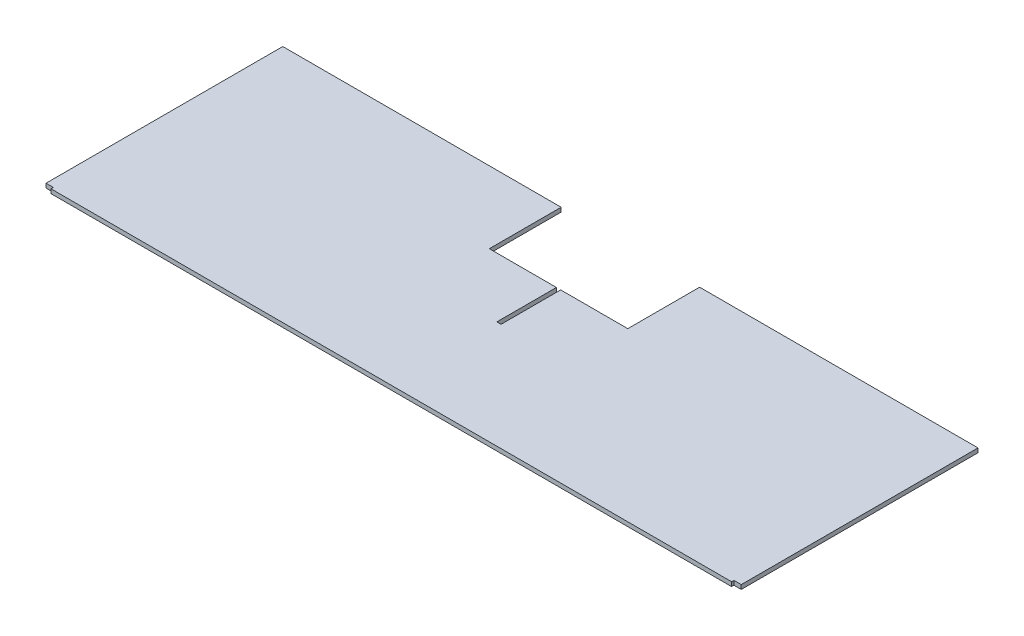
ISO-10303-21;
HEADER;
FILE_DESCRIPTION(('STEP AP214'),'2;1');
FILE_NAME('part.step','',(''),(''),'','','');
FILE_SCHEMA(('AUTOMOTIVE_DESIGN { 1 0 10303 214 1 1 1 1 }'));
ENDSEC;
DATA;
#1=APPLICATION_CONTEXT('core data for automotive mechanical design processes');
#2=APPLICATION_PROTOCOL_DEFINITION('international standard','automotive_design',2000,#1);
#3=PRODUCT_CONTEXT('',#1,'mechanical');
#4=PRODUCT('Part','Part','',(#3));
#5=PRODUCT_RELATED_PRODUCT_CATEGORY('part','',(#4));
#6=PRODUCT_DEFINITION_FORMATION('','',#4);
#7=PRODUCT_DEFINITION_CONTEXT('part definition',#1,'design');
#8=PRODUCT_DEFINITION('design','',#6,#7);
#9=PRODUCT_DEFINITION_SHAPE('','',#8);
#10=(LENGTH_UNIT() NAMED_UNIT(*) SI_UNIT(.MILLI.,.METRE.));
#11=(NAMED_UNIT(*) PLANE_ANGLE_UNIT() SI_UNIT($,.RADIAN.));
#12=(NAMED_UNIT(*) SI_UNIT($,.STERADIAN.) SOLID_ANGLE_UNIT());
#13=UNCERTAINTY_MEASURE_WITH_UNIT(LENGTH_MEASURE(1.E-05),#10,'distance_accuracy_value','');
#14=(GEOMETRIC_REPRESENTATION_CONTEXT(3) GLOBAL_UNCERTAINTY_ASSIGNED_CONTEXT((#13)) GLOBAL_UNIT_ASSIGNED_CONTEXT((#10,
#11,#12)) REPRESENTATION_CONTEXT('',''));
#15=CARTESIAN_POINT('',(0.,0.,0.));
#16=DIRECTION('',(0.,0.,1.));
#17=DIRECTION('',(1.,0.,0.));
#18=AXIS2_PLACEMENT_3D('',#15,#16,#17);
#19=CARTESIAN_POINT('',(-260.999093317,3.2,-99.5000000089999));
#20=DIRECTION('',(0.,0.,1.));
#21=DIRECTION('',(-1.,0.,0.));
#22=AXIS2_PLACEMENT_3D('',#19,#20,#21);
#23=PLANE('',#22);
#24=DIRECTION('',(0.,1.,0.));
#25=VECTOR('',#24,1.);
#26=CARTESIAN_POINT('',(54.4806399840001,0.,-99.500000009));
#27=LINE('',#26,#25);
#28=CARTESIAN_POINT('',(54.4806399840001,0.,-99.500000009));
#29=VERTEX_POINT('',#28);
#30=CARTESIAN_POINT('',(54.4806399840001,3.2,-99.500000009));
#31=VERTEX_POINT('',#30);
#32=EDGE_CURVE('E297',#29,#31,#27,.T.);
#33=ORIENTED_EDGE('',*,*,#32,.T.);
#34=DIRECTION('',(-1.,0.,0.));
#35=VECTOR('',#34,1.);
#36=CARTESIAN_POINT('',(-260.999093317,3.2,-99.5000000089999));
#37=LINE('',#36,#35);
#38=CARTESIAN_POINT('',(265.160373285,3.2,-99.500000009));
#39=VERTEX_POINT('',#38);
#40=EDGE_CURVE('E241',#39,#31,#37,.T.);
#41=ORIENTED_EDGE('',*,*,#40,.F.);
#42=DIRECTION('',(0.,1.,0.));
#43=VECTOR('',#42,1.);
#44=CARTESIAN_POINT('',(265.160373285,3.2,-99.500000009));
#45=LINE('',#44,#43);
#46=CARTESIAN_POINT('',(265.160373285,0.,-99.500000009));
#47=VERTEX_POINT('',#46);
#48=EDGE_CURVE('E194',#47,#39,#45,.T.);
#49=ORIENTED_EDGE('',*,*,#48,.F.);
#50=DIRECTION('',(1.,0.,0.));
#51=VECTOR('',#50,1.);
#52=CARTESIAN_POINT('',(0.,0.,-99.500000009));
#53=LINE('',#52,#51);
#54=EDGE_CURVE('E181',#47,#29,#53,.F.);
#55=ORIENTED_EDGE('',*,*,#54,.T.);
#56=EDGE_LOOP('',(#33,#41,#49,#55));
#57=FACE_BOUND('',#56,.T.);
#58=ADVANCED_FACE('F44',(#57),#23,.F.);
#59=CARTESIAN_POINT('',(-260.999093317,3.2,79.6876266290001));
#60=DIRECTION('',(1.,0.,0.));
#61=DIRECTION('',(0.,0.,1.));
#62=AXIS2_PLACEMENT_3D('',#59,#60,#61);
#63=PLANE('',#62);
#64=DIRECTION('',(0.,1.,0.));
#65=VECTOR('',#64,1.);
#66=CARTESIAN_POINT('',(-260.999093317,3.2,-99.5000000089999));
#67=LINE('',#66,#65);
#68=CARTESIAN_POINT('',(-260.999093317,0.,-99.5000000089999));
#69=VERTEX_POINT('',#68);
#70=CARTESIAN_POINT('',(-260.999093317,3.2,-99.5000000089999));
#71=VERTEX_POINT('',#70);
#72=EDGE_CURVE('E52',#69,#71,#67,.T.);
#73=ORIENTED_EDGE('',*,*,#72,.F.);
#74=DIRECTION('',(0.,0.,-1.));
#75=VECTOR('',#74,1.);
#76=CARTESIAN_POINT('',(-260.999093317,0.,0.));
#77=LINE('',#76,#75);
#78=CARTESIAN_POINT('',(-260.999093317,0.,79.6876266290001));
#79=VERTEX_POINT('',#78);
#80=EDGE_CURVE('E180',#69,#79,#77,.F.);
#81=ORIENTED_EDGE('',*,*,#80,.T.);
#82=DIRECTION('',(0.,1.,0.));
#83=VECTOR('',#82,1.);
#84=CARTESIAN_POINT('',(-260.999093317,3.2,79.6876266290001));
#85=LINE('',#84,#83);
#86=CARTESIAN_POINT('',(-260.999093317,3.2,79.6876266290001));
#87=VERTEX_POINT('',#86);
#88=EDGE_CURVE('E202',#79,#87,#85,.T.);
#89=ORIENTED_EDGE('',*,*,#88,.T.);
#90=DIRECTION('',(0.,0.,1.));
#91=VECTOR('',#90,1.);
#92=CARTESIAN_POINT('',(-260.999093317,3.2,79.6876266290001));
#93=LINE('',#92,#91);
#94=EDGE_CURVE('E237',#71,#87,#93,.T.);
#95=ORIENTED_EDGE('',*,*,#94,.F.);
#96=EDGE_LOOP('',(#73,#81,#89,#95));
#97=FACE_BOUND('',#96,.T.);
#98=ADVANCED_FACE('F234',(#97),#63,.F.);
#99=CARTESIAN_POINT('',(-260.999093317,3.2,79.6876266290001));
#100=DIRECTION('',(0.,0.,-1.));
#101=DIRECTION('',(1.,0.,0.));
#102=AXIS2_PLACEMENT_3D('',#99,#100,#101);
#103=PLANE('',#102);
#104=ORIENTED_EDGE('',*,*,#88,.F.);
#105=DIRECTION('',(1.,0.,0.));
#106=VECTOR('',#105,1.);
#107=CARTESIAN_POINT('',(0.,0.,79.6876266290001));
#108=LINE('',#107,#106);
#109=CARTESIAN_POINT('',(-255.462493265,0.,79.6876266290001));
#110=VERTEX_POINT('',#109);
#111=EDGE_CURVE('E230',#79,#110,#108,.T.);
#112=ORIENTED_EDGE('',*,*,#111,.T.);
#113=DIRECTION('',(0.,1.,0.));
#114=VECTOR('',#113,1.);
#115=CARTESIAN_POINT('',(-255.462493265,3.2,79.6876266290001));
#116=LINE('',#115,#114);
#117=CARTESIAN_POINT('',(-255.462493265,3.2,79.6876266290001));
#118=VERTEX_POINT('',#117);
#119=EDGE_CURVE('E200',#110,#118,#116,.T.);
#120=ORIENTED_EDGE('',*,*,#119,.T.);
#121=DIRECTION('',(1.,0.,0.));
#122=VECTOR('',#121,1.);
#123=CARTESIAN_POINT('',(-260.999093317,3.2,79.6876266290001));
#124=LINE('',#123,#122);
#125=EDGE_CURVE('E240',#87,#118,#124,.T.);
#126=ORIENTED_EDGE('',*,*,#125,.F.);
#127=EDGE_LOOP('',(#104,#112,#120,#126));
#128=FACE_BOUND('',#127,.T.);
#129=ADVANCED_FACE('F339',(#128),#103,.F.);
#130=CARTESIAN_POINT('',(-255.462493265,3.2,79.6876266290001));
#131=DIRECTION('',(1.,0.,0.));
#132=DIRECTION('',(0.,0.,1.));
#133=AXIS2_PLACEMENT_3D('',#130,#131,#132);
#134=PLANE('',#133);
#135=ORIENTED_EDGE('',*,*,#119,.F.);
#136=DIRECTION('',(0.,0.,-1.));
#137=VECTOR('',#136,1.);
#138=CARTESIAN_POINT('',(-255.462493265,0.,0.));
#139=LINE('',#138,#137);
#140=CARTESIAN_POINT('',(-255.462493265,0.,81.4500000410001));
#141=VERTEX_POINT('',#140);
#142=EDGE_CURVE('E228',#110,#141,#139,.F.);
#143=ORIENTED_EDGE('',*,*,#142,.T.);
#144=DIRECTION('',(0.,1.,0.));
#145=VECTOR('',#144,1.);
#146=CARTESIAN_POINT('',(-255.462493265,3.2,81.4500000410001));
#147=LINE('',#146,#145);
#148=CARTESIAN_POINT('',(-255.462493265,3.2,81.4500000410001));
#149=VERTEX_POINT('',#148);
#150=EDGE_CURVE('E198',#141,#149,#147,.T.);
#151=ORIENTED_EDGE('',*,*,#150,.T.);
#152=DIRECTION('',(0.,0.,1.));
#153=VECTOR('',#152,1.);
#154=CARTESIAN_POINT('',(-255.462493265,3.2,79.6876266290001));
#155=LINE('',#154,#153);
#156=EDGE_CURVE('E243',#118,#149,#155,.T.);
#157=ORIENTED_EDGE('',*,*,#156,.F.);
#158=EDGE_LOOP('',(#135,#143,#151,#157));
#159=FACE_BOUND('',#158,.T.);
#160=ADVANCED_FACE('F357',(#159),#134,.F.);
#161=CARTESIAN_POINT('',(-255.462493265,3.2,81.4500000410001));
#162=DIRECTION('',(0.,0.,-1.));
#163=DIRECTION('',(1.,0.,0.));
#164=AXIS2_PLACEMENT_3D('',#161,#162,#163);
#165=PLANE('',#164);
#166=ORIENTED_EDGE('',*,*,#150,.F.);
#167=DIRECTION('',(1.,0.,0.));
#168=VECTOR('',#167,1.);
#169=CARTESIAN_POINT('',(0.,0.,81.4500000410001));
#170=LINE('',#169,#168);
#171=CARTESIAN_POINT('',(259.623773233,0.,81.450000041));
#172=VERTEX_POINT('',#171);
#173=EDGE_CURVE('E225',#141,#172,#170,.T.);
#174=ORIENTED_EDGE('',*,*,#173,.T.);
#175=DIRECTION('',(0.,1.,0.));
#176=VECTOR('',#175,1.);
#177=CARTESIAN_POINT('',(259.623773233,3.2,81.450000041));
#178=LINE('',#177,#176);
#179=CARTESIAN_POINT('',(259.623773233,3.2,81.450000041));
#180=VERTEX_POINT('',#179);
#181=EDGE_CURVE('E196',#172,#180,#178,.T.);
#182=ORIENTED_EDGE('',*,*,#181,.T.);
#183=DIRECTION('',(1.,0.,0.));
#184=VECTOR('',#183,1.);
#185=CARTESIAN_POINT('',(-255.462493265,3.2,81.4500000410001));
#186=LINE('',#185,#184);
#187=EDGE_CURVE('E214',#149,#180,#186,.T.);
#188=ORIENTED_EDGE('',*,*,#187,.F.);
#189=EDGE_LOOP('',(#166,#174,#182,#188));
#190=FACE_BOUND('',#189,.T.);
#191=ADVANCED_FACE('F354',(#190),#165,.F.);
#192=CARTESIAN_POINT('',(259.623773233,3.2,79.687626629));
#193=DIRECTION('',(-1.,0.,0.));
#194=DIRECTION('',(0.,0.,-1.));
#195=AXIS2_PLACEMENT_3D('',#192,#193,#194);
#196=PLANE('',#195);
#197=ORIENTED_EDGE('',*,*,#181,.F.);
#198=DIRECTION('',(0.,0.,-1.));
#199=VECTOR('',#198,1.);
#200=CARTESIAN_POINT('',(259.623773233,0.,0.));
#201=LINE('',#200,#199);
#202=CARTESIAN_POINT('',(259.623773233,0.,79.687626629));
#203=VERTEX_POINT('',#202);
#204=EDGE_CURVE('E222',#172,#203,#201,.T.);
#205=ORIENTED_EDGE('',*,*,#204,.T.);
#206=DIRECTION('',(0.,1.,0.));
#207=VECTOR('',#206,1.);
#208=CARTESIAN_POINT('',(259.623773233,3.2,79.687626629));
#209=LINE('',#208,#207);
#210=CARTESIAN_POINT('',(259.623773233,3.2,79.687626629));
#211=VERTEX_POINT('',#210);
#212=EDGE_CURVE('E193',#203,#211,#209,.T.);
#213=ORIENTED_EDGE('',*,*,#212,.T.);
#214=DIRECTION('',(0.,0.,-1.));
#215=VECTOR('',#214,1.);
#216=CARTESIAN_POINT('',(259.623773233,3.2,79.687626629));
#217=LINE('',#216,#215);
#218=EDGE_CURVE('E209',#180,#211,#217,.T.);
#219=ORIENTED_EDGE('',*,*,#218,.F.);
#220=EDGE_LOOP('',(#197,#205,#213,#219));
#221=FACE_BOUND('',#220,.T.);
#222=ADVANCED_FACE('F258',(#221),#196,.F.);
#223=CARTESIAN_POINT('',(265.160373285,3.2,79.687626629));
#224=DIRECTION('',(0.,0.,-1.));
#225=DIRECTION('',(1.,0.,0.));
#226=AXIS2_PLACEMENT_3D('',#223,#224,#225);
#227=PLANE('',#226);
#228=ORIENTED_EDGE('',*,*,#212,.F.);
#229=DIRECTION('',(1.,0.,0.));
#230=VECTOR('',#229,1.);
#231=CARTESIAN_POINT('',(0.,0.,79.687626629));
#232=LINE('',#231,#230);
#233=CARTESIAN_POINT('',(265.160373285,0.,79.687626629));
#234=VERTEX_POINT('',#233);
#235=EDGE_CURVE('E218',#203,#234,#232,.T.);
#236=ORIENTED_EDGE('',*,*,#235,.T.);
#237=DIRECTION('',(0.,1.,0.));
#238=VECTOR('',#237,1.);
#239=CARTESIAN_POINT('',(265.160373285,3.2,79.687626629));
#240=LINE('',#239,#238);
#241=CARTESIAN_POINT('',(265.160373285,3.2,79.687626629));
#242=VERTEX_POINT('',#241);
#243=EDGE_CURVE('E191',#234,#242,#240,.T.);
#244=ORIENTED_EDGE('',*,*,#243,.T.);
#245=DIRECTION('',(1.,0.,0.));
#246=VECTOR('',#245,1.);
#247=CARTESIAN_POINT('',(265.160373285,3.2,79.687626629));
#248=LINE('',#247,#246);
#249=EDGE_CURVE('E204',#211,#242,#248,.T.);
#250=ORIENTED_EDGE('',*,*,#249,.F.);
#251=EDGE_LOOP('',(#228,#236,#244,#250));
#252=FACE_BOUND('',#251,.T.);
#253=ADVANCED_FACE('F262',(#252),#227,.F.);
#254=CARTESIAN_POINT('',(265.160373285,3.2,79.687626629));
#255=DIRECTION('',(-1.,0.,0.));
#256=DIRECTION('',(0.,0.,-1.));
#257=AXIS2_PLACEMENT_3D('',#254,#255,#256);
#258=PLANE('',#257);
#259=ORIENTED_EDGE('',*,*,#243,.F.);
#260=DIRECTION('',(0.,0.,-1.));
#261=VECTOR('',#260,1.);
#262=CARTESIAN_POINT('',(265.160373285,0.,0.));
#263=LINE('',#262,#261);
#264=EDGE_CURVE('E182',#234,#47,#263,.T.);
#265=ORIENTED_EDGE('',*,*,#264,.T.);
#266=ORIENTED_EDGE('',*,*,#48,.T.);
#267=DIRECTION('',(0.,0.,-1.));
#268=VECTOR('',#267,1.);
#269=CARTESIAN_POINT('',(265.160373285,3.2,79.687626629));
#270=LINE('',#269,#268);
#271=EDGE_CURVE('E221',#242,#39,#270,.T.);
#272=ORIENTED_EDGE('',*,*,#271,.F.);
#273=EDGE_LOOP('',(#259,#265,#266,#272));
#274=FACE_BOUND('',#273,.T.);
#275=ADVANCED_FACE('F264',(#274),#258,.F.);
#276=DIRECTION('',(0.,1.,0.));
#277=VECTOR('',#276,1.);
#278=CARTESIAN_POINT('',(-50.3193600159999,0.,-99.500000009));
#279=LINE('',#278,#277);
#280=CARTESIAN_POINT('',(-50.3193600159999,0.,-99.500000009));
#281=VERTEX_POINT('',#280);
#282=CARTESIAN_POINT('',(-50.3193600159999,3.2,-99.500000009));
#283=VERTEX_POINT('',#282);
#284=EDGE_CURVE('E160',#281,#283,#279,.T.);
#285=ORIENTED_EDGE('',*,*,#284,.F.);
#286=EDGE_CURVE('E172',#281,#69,#53,.F.);
#287=ORIENTED_EDGE('',*,*,#286,.T.);
#288=ORIENTED_EDGE('',*,*,#72,.T.);
#289=EDGE_CURVE('E174',#283,#71,#37,.T.);
#290=ORIENTED_EDGE('',*,*,#289,.F.);
#291=EDGE_LOOP('',(#285,#287,#288,#290));
#292=FACE_BOUND('',#291,.T.);
#293=ADVANCED_FACE('F46',(#292),#23,.F.);
#294=CARTESIAN_POINT('',(0.,3.2,0.));
#295=DIRECTION('',(0.,-1.,0.));
#296=DIRECTION('',(0.,0.,-1.));
#297=AXIS2_PLACEMENT_3D('',#294,#295,#296);
#298=PLANE('',#297);
#299=DIRECTION('',(0.,0.,1.));
#300=VECTOR('',#299,1.);
#301=CARTESIAN_POINT('',(0.480639984000086,3.2,-199.000000018));
#302=LINE('',#301,#300);
#303=CARTESIAN_POINT('',(0.480639984000105,3.2,-45.140000009));
#304=VERTEX_POINT('',#303);
#305=CARTESIAN_POINT('',(0.48063998400011,3.2,0.));
#306=VERTEX_POINT('',#305);
#307=EDGE_CURVE('E276',#304,#306,#302,.T.);
#308=ORIENTED_EDGE('',*,*,#307,.F.);
#309=DIRECTION('',(1.,0.,0.));
#310=VECTOR('',#309,1.);
#311=CARTESIAN_POINT('',(0.480639984000102,3.2,-45.140000009));
#312=LINE('',#311,#310);
#313=CARTESIAN_POINT('',(-50.3193600159999,3.2,-45.140000009));
#314=VERTEX_POINT('',#313);
#315=EDGE_CURVE('E67',#314,#304,#312,.T.);
#316=ORIENTED_EDGE('',*,*,#315,.F.);
#317=DIRECTION('',(0.,0.,1.));
#318=VECTOR('',#317,1.);
#319=CARTESIAN_POINT('',(-50.3193600159999,3.2,-99.500000009));
#320=LINE('',#319,#318);
#321=EDGE_CURVE('E295',#283,#314,#320,.T.);
#322=ORIENTED_EDGE('',*,*,#321,.F.);
#323=ORIENTED_EDGE('',*,*,#289,.T.);
#324=ORIENTED_EDGE('',*,*,#94,.T.);
#325=ORIENTED_EDGE('',*,*,#125,.T.);
#326=ORIENTED_EDGE('',*,*,#156,.T.);
#327=ORIENTED_EDGE('',*,*,#187,.T.);
#328=ORIENTED_EDGE('',*,*,#218,.T.);
#329=ORIENTED_EDGE('',*,*,#249,.T.);
#330=ORIENTED_EDGE('',*,*,#271,.T.);
#331=ORIENTED_EDGE('',*,*,#40,.T.);
#332=DIRECTION('',(0.,0.,-1.));
#333=VECTOR('',#332,1.);
#334=CARTESIAN_POINT('',(54.4806399840001,3.2,-99.500000009));
#335=LINE('',#334,#333);
#336=CARTESIAN_POINT('',(54.4806399840001,3.2,-45.140000009));
#337=VERTEX_POINT('',#336);
#338=EDGE_CURVE('E287',#337,#31,#335,.T.);
#339=ORIENTED_EDGE('',*,*,#338,.F.);
#340=DIRECTION('',(1.,0.,0.));
#341=VECTOR('',#340,1.);
#342=CARTESIAN_POINT('',(3.6806399840001,3.2,-45.140000009));
#343=LINE('',#342,#341);
#344=CARTESIAN_POINT('',(3.6806399840001,3.2,-45.140000009));
#345=VERTEX_POINT('',#344);
#346=EDGE_CURVE('E292',#345,#337,#343,.T.);
#347=ORIENTED_EDGE('',*,*,#346,.F.);
#348=DIRECTION('',(0.,0.,-1.));
#349=VECTOR('',#348,1.);
#350=CARTESIAN_POINT('',(3.68063998400009,3.2,-199.000000018));
#351=LINE('',#350,#349);
#352=CARTESIAN_POINT('',(3.68063998400011,3.2,0.));
#353=VERTEX_POINT('',#352);
#354=EDGE_CURVE('E278',#353,#345,#351,.T.);
#355=ORIENTED_EDGE('',*,*,#354,.F.);
#356=DIRECTION('',(1.,0.,0.));
#357=VECTOR('',#356,1.);
#358=CARTESIAN_POINT('',(0.48063998400011,3.2,0.));
#359=LINE('',#358,#357);
#360=EDGE_CURVE('E272',#306,#353,#359,.T.);
#361=ORIENTED_EDGE('',*,*,#360,.F.);
#362=EDGE_LOOP('',(#308,#316,#322,#323,#324,#325,#326,#327,#328,#329,#330,#331,#339,#347,#355,#361));
#363=FACE_BOUND('',#362,.T.);
#364=ADVANCED_FACE('F254',(#363),#298,.F.);
#365=CARTESIAN_POINT('',(0.,0.,0.));
#366=DIRECTION('',(0.,-1.,0.));
#367=DIRECTION('',(0.,0.,-1.));
#368=AXIS2_PLACEMENT_3D('',#365,#366,#367);
#369=PLANE('',#368);
#370=DIRECTION('',(1.,0.,0.));
#371=VECTOR('',#370,1.);
#372=CARTESIAN_POINT('',(0.480639984000102,0.,-45.140000009));
#373=LINE('',#372,#371);
#374=CARTESIAN_POINT('',(-50.3193600159999,0.,-45.140000009));
#375=VERTEX_POINT('',#374);
#376=CARTESIAN_POINT('',(0.480639984000102,0.,-45.140000009));
#377=VERTEX_POINT('',#376);
#378=EDGE_CURVE('E167',#375,#377,#373,.T.);
#379=ORIENTED_EDGE('',*,*,#378,.T.);
#380=DIRECTION('',(0.,0.,-1.));
#381=VECTOR('',#380,1.);
#382=CARTESIAN_POINT('',(0.48063998400011,0.,0.));
#383=LINE('',#382,#381);
#384=CARTESIAN_POINT('',(0.48063998400011,0.,0.));
#385=VERTEX_POINT('',#384);
#386=EDGE_CURVE('E11',#385,#377,#383,.T.);
#387=ORIENTED_EDGE('',*,*,#386,.F.);
#388=DIRECTION('',(1.,0.,0.));
#389=VECTOR('',#388,1.);
#390=CARTESIAN_POINT('',(0.48063998400011,0.,0.));
#391=LINE('',#390,#389);
#392=CARTESIAN_POINT('',(3.68063998400011,0.,0.));
#393=VERTEX_POINT('',#392);
#394=EDGE_CURVE('E270',#385,#393,#391,.T.);
#395=ORIENTED_EDGE('',*,*,#394,.T.);
#396=DIRECTION('',(0.,0.,-1.));
#397=VECTOR('',#396,1.);
#398=CARTESIAN_POINT('',(3.68063998400009,0.,-199.000000018));
#399=LINE('',#398,#397);
#400=CARTESIAN_POINT('',(3.6806399840001,0.,-45.140000009));
#401=VERTEX_POINT('',#400);
#402=EDGE_CURVE('E275',#393,#401,#399,.T.);
#403=ORIENTED_EDGE('',*,*,#402,.T.);
#404=DIRECTION('',(1.,0.,0.));
#405=VECTOR('',#404,1.);
#406=CARTESIAN_POINT('',(3.6806399840001,0.,-45.140000009));
#407=LINE('',#406,#405);
#408=CARTESIAN_POINT('',(54.4806399840001,0.,-45.140000009));
#409=VERTEX_POINT('',#408);
#410=EDGE_CURVE('E59',#401,#409,#407,.T.);
#411=ORIENTED_EDGE('',*,*,#410,.T.);
#412=DIRECTION('',(0.,0.,-1.));
#413=VECTOR('',#412,1.);
#414=CARTESIAN_POINT('',(54.4806399840001,0.,-99.500000009));
#415=LINE('',#414,#413);
#416=EDGE_CURVE('E288',#409,#29,#415,.T.);
#417=ORIENTED_EDGE('',*,*,#416,.T.);
#418=ORIENTED_EDGE('',*,*,#54,.F.);
#419=ORIENTED_EDGE('',*,*,#264,.F.);
#420=ORIENTED_EDGE('',*,*,#235,.F.);
#421=ORIENTED_EDGE('',*,*,#204,.F.);
#422=ORIENTED_EDGE('',*,*,#173,.F.);
#423=ORIENTED_EDGE('',*,*,#142,.F.);
#424=ORIENTED_EDGE('',*,*,#111,.F.);
#425=ORIENTED_EDGE('',*,*,#80,.F.);
#426=ORIENTED_EDGE('',*,*,#286,.F.);
#427=DIRECTION('',(0.,0.,1.));
#428=VECTOR('',#427,1.);
#429=CARTESIAN_POINT('',(-50.3193600159999,0.,-99.500000009));
#430=LINE('',#429,#428);
#431=EDGE_CURVE('E156',#281,#375,#430,.T.);
#432=ORIENTED_EDGE('',*,*,#431,.T.);
#433=EDGE_LOOP('',(#379,#387,#395,#403,#411,#417,#418,#419,#420,#421,#422,#423,#424,#425,#426,#432));
#434=FACE_BOUND('',#433,.T.);
#435=ADVANCED_FACE('F177',(#434),#369,.T.);
#436=CARTESIAN_POINT('',(3.68063998400009,0.,-199.000000018));
#437=DIRECTION('',(1.,0.,0.));
#438=DIRECTION('',(0.,0.,-1.));
#439=AXIS2_PLACEMENT_3D('',#436,#437,#438);
#440=PLANE('',#439);
#441=ORIENTED_EDGE('',*,*,#354,.T.);
#442=DIRECTION('',(0.,1.,0.));
#443=VECTOR('',#442,1.);
#444=CARTESIAN_POINT('',(3.6806399840001,0.,-45.140000009));
#445=LINE('',#444,#443);
#446=EDGE_CURVE('E291',#401,#345,#445,.T.);
#447=ORIENTED_EDGE('',*,*,#446,.F.);
#448=ORIENTED_EDGE('',*,*,#402,.F.);
#449=DIRECTION('',(0.,1.,0.));
#450=VECTOR('',#449,1.);
#451=CARTESIAN_POINT('',(3.68063998400011,0.,0.));
#452=LINE('',#451,#450);
#453=EDGE_CURVE('E186',#393,#353,#452,.T.);
#454=ORIENTED_EDGE('',*,*,#453,.T.);
#455=EDGE_LOOP('',(#441,#447,#448,#454));
#456=FACE_BOUND('',#455,.T.);
#457=ADVANCED_FACE('F318',(#456),#440,.F.);
#458=CARTESIAN_POINT('',(0.48063998400011,0.,0.));
#459=DIRECTION('',(0.,0.,1.));
#460=DIRECTION('',(1.,0.,0.));
#461=AXIS2_PLACEMENT_3D('',#458,#459,#460);
#462=PLANE('',#461);
#463=ORIENTED_EDGE('',*,*,#360,.T.);
#464=ORIENTED_EDGE('',*,*,#453,.F.);
#465=ORIENTED_EDGE('',*,*,#394,.F.);
#466=DIRECTION('',(0.,1.,0.));
#467=VECTOR('',#466,1.);
#468=CARTESIAN_POINT('',(0.48063998400011,0.,0.));
#469=LINE('',#468,#467);
#470=EDGE_CURVE('E267',#385,#306,#469,.T.);
#471=ORIENTED_EDGE('',*,*,#470,.T.);
#472=EDGE_LOOP('',(#463,#464,#465,#471));
#473=FACE_BOUND('',#472,.T.);
#474=ADVANCED_FACE('F313',(#473),#462,.F.);
#475=CARTESIAN_POINT('',(0.480639984000086,0.,-199.000000018));
#476=DIRECTION('',(-1.,0.,0.));
#477=DIRECTION('',(0.,0.,1.));
#478=AXIS2_PLACEMENT_3D('',#475,#476,#477);
#479=PLANE('',#478);
#480=ORIENTED_EDGE('',*,*,#386,.T.);
#481=DIRECTION('',(0.,1.,0.));
#482=VECTOR('',#481,1.);
#483=CARTESIAN_POINT('',(0.480639984000102,0.,-45.140000009));
#484=LINE('',#483,#482);
#485=EDGE_CURVE('E281',#377,#304,#484,.T.);
#486=ORIENTED_EDGE('',*,*,#485,.T.);
#487=ORIENTED_EDGE('',*,*,#307,.T.);
#488=ORIENTED_EDGE('',*,*,#470,.F.);
#489=EDGE_LOOP('',(#480,#486,#487,#488));
#490=FACE_BOUND('',#489,.T.);
#491=ADVANCED_FACE('F310',(#490),#479,.F.);
#492=CARTESIAN_POINT('',(0.480639984000102,0.,-45.140000009));
#493=DIRECTION('',(0.,0.,1.));
#494=DIRECTION('',(1.,0.,0.));
#495=AXIS2_PLACEMENT_3D('',#492,#493,#494);
#496=PLANE('',#495);
#497=ORIENTED_EDGE('',*,*,#315,.T.);
#498=ORIENTED_EDGE('',*,*,#485,.F.);
#499=ORIENTED_EDGE('',*,*,#378,.F.);
#500=DIRECTION('',(0.,1.,0.));
#501=VECTOR('',#500,1.);
#502=CARTESIAN_POINT('',(-50.3193600159999,0.,-45.140000009));
#503=LINE('',#502,#501);
#504=EDGE_CURVE('E162',#375,#314,#503,.T.);
#505=ORIENTED_EDGE('',*,*,#504,.T.);
#506=EDGE_LOOP('',(#497,#498,#499,#505));
#507=FACE_BOUND('',#506,.T.);
#508=ADVANCED_FACE('F454',(#507),#496,.F.);
#509=CARTESIAN_POINT('',(-50.3193600159999,0.,-99.500000009));
#510=DIRECTION('',(-1.,0.,0.));
#511=DIRECTION('',(0.,0.,1.));
#512=AXIS2_PLACEMENT_3D('',#509,#510,#511);
#513=PLANE('',#512);
#514=ORIENTED_EDGE('',*,*,#321,.T.);
#515=ORIENTED_EDGE('',*,*,#504,.F.);
#516=ORIENTED_EDGE('',*,*,#431,.F.);
#517=ORIENTED_EDGE('',*,*,#284,.T.);
#518=EDGE_LOOP('',(#514,#515,#516,#517));
#519=FACE_BOUND('',#518,.T.);
#520=ADVANCED_FACE('F159',(#519),#513,.F.);
#521=CARTESIAN_POINT('',(54.4806399840001,0.,-99.500000009));
#522=DIRECTION('',(1.,0.,0.));
#523=DIRECTION('',(0.,0.,-1.));
#524=AXIS2_PLACEMENT_3D('',#521,#522,#523);
#525=PLANE('',#524);
#526=ORIENTED_EDGE('',*,*,#338,.T.);
#527=ORIENTED_EDGE('',*,*,#32,.F.);
#528=ORIENTED_EDGE('',*,*,#416,.F.);
#529=DIRECTION('',(0.,1.,0.));
#530=VECTOR('',#529,1.);
#531=CARTESIAN_POINT('',(54.4806399840001,0.,-45.140000009));
#532=LINE('',#531,#530);
#533=EDGE_CURVE('E300',#409,#337,#532,.T.);
#534=ORIENTED_EDGE('',*,*,#533,.T.);
#535=EDGE_LOOP('',(#526,#527,#528,#534));
#536=FACE_BOUND('',#535,.T.);
#537=ADVANCED_FACE('F324',(#536),#525,.F.);
#538=CARTESIAN_POINT('',(3.6806399840001,0.,-45.140000009));
#539=DIRECTION('',(0.,0.,1.));
#540=DIRECTION('',(1.,0.,0.));
#541=AXIS2_PLACEMENT_3D('',#538,#539,#540);
#542=PLANE('',#541);
#543=ORIENTED_EDGE('',*,*,#346,.T.);
#544=ORIENTED_EDGE('',*,*,#533,.F.);
#545=ORIENTED_EDGE('',*,*,#410,.F.);
#546=ORIENTED_EDGE('',*,*,#446,.T.);
#547=EDGE_LOOP('',(#543,#544,#545,#546));
#548=FACE_BOUND('',#547,.T.);
#549=ADVANCED_FACE('F325',(#548),#542,.F.);
#550=CLOSED_SHELL('',(#58,#98,#129,#160,#191,#222,#253,#275,#293,#364,#435,#457,#474,#491,#508,
#520,#537,#549));
#551=MANIFOLD_SOLID_BREP('B2',#550);
#552=ADVANCED_BREP_SHAPE_REPRESENTATION('',(#18,#551),#14);
#553=SHAPE_DEFINITION_REPRESENTATION(#9,#552);
ENDSEC;
END-ISO-10303-21;
